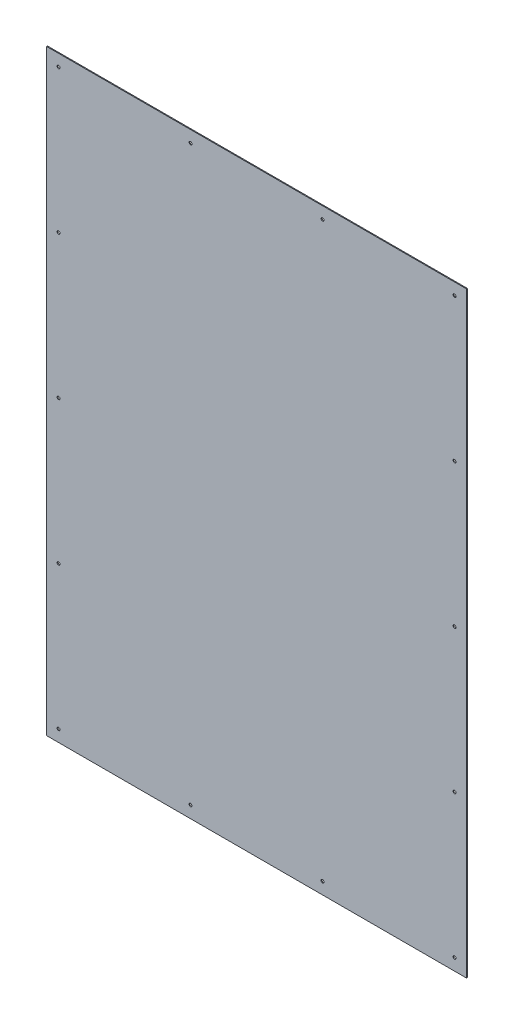
ISO-10303-21;
HEADER;
FILE_DESCRIPTION(('STEP AP214'),'2;1');
FILE_NAME('part.step','',(''),(''),'','','');
FILE_SCHEMA(('AUTOMOTIVE_DESIGN { 1 0 10303 214 1 1 1 1 }'));
ENDSEC;
DATA;
#1=APPLICATION_CONTEXT('core data for automotive mechanical design processes');
#2=APPLICATION_PROTOCOL_DEFINITION('international standard','automotive_design',2000,#1);
#3=PRODUCT_CONTEXT('',#1,'mechanical');
#4=PRODUCT('Part','Part','',(#3));
#5=PRODUCT_RELATED_PRODUCT_CATEGORY('part','',(#4));
#6=PRODUCT_DEFINITION_FORMATION('','',#4);
#7=PRODUCT_DEFINITION_CONTEXT('part definition',#1,'design');
#8=PRODUCT_DEFINITION('design','',#6,#7);
#9=PRODUCT_DEFINITION_SHAPE('','',#8);
#10=(LENGTH_UNIT() NAMED_UNIT(*) SI_UNIT(.MILLI.,.METRE.));
#11=(NAMED_UNIT(*) PLANE_ANGLE_UNIT() SI_UNIT($,.RADIAN.));
#12=(NAMED_UNIT(*) SI_UNIT($,.STERADIAN.) SOLID_ANGLE_UNIT());
#13=UNCERTAINTY_MEASURE_WITH_UNIT(LENGTH_MEASURE(1.E-05),#10,'distance_accuracy_value','');
#14=(GEOMETRIC_REPRESENTATION_CONTEXT(3) GLOBAL_UNCERTAINTY_ASSIGNED_CONTEXT((#13)) GLOBAL_UNIT_ASSIGNED_CONTEXT((#10,
#11,#12)) REPRESENTATION_CONTEXT('',''));
#15=CARTESIAN_POINT('',(0.,0.,0.));
#16=DIRECTION('',(0.,0.,1.));
#17=DIRECTION('',(1.,0.,0.));
#18=AXIS2_PLACEMENT_3D('',#15,#16,#17);
#19=CARTESIAN_POINT('',(450.,640.,1.9));
#20=DIRECTION('',(-1.,0.,0.));
#21=DIRECTION('',(0.,-1.,0.));
#22=AXIS2_PLACEMENT_3D('',#19,#20,#21);
#23=PLANE('',#22);
#24=DIRECTION('',(0.,1.,0.));
#25=VECTOR('',#24,1.);
#26=CARTESIAN_POINT('',(450.,640.,0.));
#27=LINE('',#26,#25);
#28=CARTESIAN_POINT('',(450.,-640.,0.));
#29=VERTEX_POINT('',#28);
#30=CARTESIAN_POINT('',(450.,640.,0.));
#31=VERTEX_POINT('',#30);
#32=EDGE_CURVE('E98',#29,#31,#27,.T.);
#33=ORIENTED_EDGE('',*,*,#32,.T.);
#34=DIRECTION('',(0.,0.,-1.));
#35=VECTOR('',#34,1.);
#36=CARTESIAN_POINT('',(450.,640.,1.9));
#37=LINE('',#36,#35);
#38=CARTESIAN_POINT('',(450.,640.,1.9));
#39=VERTEX_POINT('',#38);
#40=EDGE_CURVE('E11',#39,#31,#37,.T.);
#41=ORIENTED_EDGE('',*,*,#40,.F.);
#42=DIRECTION('',(0.,1.,0.));
#43=VECTOR('',#42,1.);
#44=CARTESIAN_POINT('',(450.,640.,1.9));
#45=LINE('',#44,#43);
#46=CARTESIAN_POINT('',(450.,-640.,1.9));
#47=VERTEX_POINT('',#46);
#48=EDGE_CURVE('E85',#47,#39,#45,.T.);
#49=ORIENTED_EDGE('',*,*,#48,.F.);
#50=DIRECTION('',(0.,0.,-1.));
#51=VECTOR('',#50,1.);
#52=CARTESIAN_POINT('',(450.,-640.,1.9));
#53=LINE('',#52,#51);
#54=EDGE_CURVE('E94',#47,#29,#53,.T.);
#55=ORIENTED_EDGE('',*,*,#54,.T.);
#56=EDGE_LOOP('',(#33,#41,#49,#55));
#57=FACE_BOUND('',#56,.T.);
#58=ADVANCED_FACE('F32',(#57),#23,.F.);
#59=CARTESIAN_POINT('',(-450.,640.,1.9));
#60=DIRECTION('',(0.,-1.,0.));
#61=DIRECTION('',(0.,0.,-1.));
#62=AXIS2_PLACEMENT_3D('',#59,#60,#61);
#63=PLANE('',#62);
#64=DIRECTION('',(-1.,0.,0.));
#65=VECTOR('',#64,1.);
#66=CARTESIAN_POINT('',(-450.,640.,0.));
#67=LINE('',#66,#65);
#68=CARTESIAN_POINT('',(-450.,640.,0.));
#69=VERTEX_POINT('',#68);
#70=EDGE_CURVE('E89',#31,#69,#67,.T.);
#71=ORIENTED_EDGE('',*,*,#70,.T.);
#72=DIRECTION('',(0.,0.,-1.));
#73=VECTOR('',#72,1.);
#74=CARTESIAN_POINT('',(-450.,640.,1.9));
#75=LINE('',#74,#73);
#76=CARTESIAN_POINT('',(-450.,640.,1.9));
#77=VERTEX_POINT('',#76);
#78=EDGE_CURVE('E41',#77,#69,#75,.T.);
#79=ORIENTED_EDGE('',*,*,#78,.F.);
#80=DIRECTION('',(-1.,0.,0.));
#81=VECTOR('',#80,1.);
#82=CARTESIAN_POINT('',(-450.,640.,1.9));
#83=LINE('',#82,#81);
#84=EDGE_CURVE('E80',#39,#77,#83,.T.);
#85=ORIENTED_EDGE('',*,*,#84,.F.);
#86=ORIENTED_EDGE('',*,*,#40,.T.);
#87=EDGE_LOOP('',(#71,#79,#85,#86));
#88=FACE_BOUND('',#87,.T.);
#89=ADVANCED_FACE('F88',(#88),#63,.F.);
#90=CARTESIAN_POINT('',(-450.,640.,1.9));
#91=DIRECTION('',(1.,0.,0.));
#92=DIRECTION('',(0.,1.,0.));
#93=AXIS2_PLACEMENT_3D('',#90,#91,#92);
#94=PLANE('',#93);
#95=DIRECTION('',(0.,-1.,0.));
#96=VECTOR('',#95,1.);
#97=CARTESIAN_POINT('',(-450.,640.,0.));
#98=LINE('',#97,#96);
#99=CARTESIAN_POINT('',(-450.,-640.,0.));
#100=VERTEX_POINT('',#99);
#101=EDGE_CURVE('E67',#69,#100,#98,.T.);
#102=ORIENTED_EDGE('',*,*,#101,.T.);
#103=DIRECTION('',(0.,0.,-1.));
#104=VECTOR('',#103,1.);
#105=CARTESIAN_POINT('',(-450.,-640.,1.9));
#106=LINE('',#105,#104);
#107=CARTESIAN_POINT('',(-450.,-640.,1.9));
#108=VERTEX_POINT('',#107);
#109=EDGE_CURVE('E90',#108,#100,#106,.T.);
#110=ORIENTED_EDGE('',*,*,#109,.F.);
#111=DIRECTION('',(0.,-1.,0.));
#112=VECTOR('',#111,1.);
#113=CARTESIAN_POINT('',(-450.,640.,1.9));
#114=LINE('',#113,#112);
#115=EDGE_CURVE('E83',#77,#108,#114,.T.);
#116=ORIENTED_EDGE('',*,*,#115,.F.);
#117=ORIENTED_EDGE('',*,*,#78,.T.);
#118=EDGE_LOOP('',(#102,#110,#116,#117));
#119=FACE_BOUND('',#118,.T.);
#120=ADVANCED_FACE('F92',(#119),#94,.F.);
#121=CARTESIAN_POINT('',(-450.,-640.,1.9));
#122=DIRECTION('',(0.,1.,0.));
#123=DIRECTION('',(0.,0.,1.));
#124=AXIS2_PLACEMENT_3D('',#121,#122,#123);
#125=PLANE('',#124);
#126=DIRECTION('',(1.,0.,0.));
#127=VECTOR('',#126,1.);
#128=CARTESIAN_POINT('',(-450.,-640.,0.));
#129=LINE('',#128,#127);
#130=EDGE_CURVE('E73',#100,#29,#129,.T.);
#131=ORIENTED_EDGE('',*,*,#130,.T.);
#132=ORIENTED_EDGE('',*,*,#54,.F.);
#133=DIRECTION('',(1.,0.,0.));
#134=VECTOR('',#133,1.);
#135=CARTESIAN_POINT('',(-450.,-640.,1.9));
#136=LINE('',#135,#134);
#137=EDGE_CURVE('E50',#108,#47,#136,.T.);
#138=ORIENTED_EDGE('',*,*,#137,.F.);
#139=ORIENTED_EDGE('',*,*,#109,.T.);
#140=EDGE_LOOP('',(#131,#132,#138,#139));
#141=FACE_BOUND('',#140,.T.);
#142=ADVANCED_FACE('F200',(#141),#125,.F.);
#143=CARTESIAN_POINT('',(0.,0.,1.9));
#144=DIRECTION('',(0.,0.,1.));
#145=DIRECTION('',(1.,0.,0.));
#146=AXIS2_PLACEMENT_3D('',#143,#144,#145);
#147=PLANE('',#146);
#148=CARTESIAN_POINT('',(141.52,-614.6,1.9));
#149=DIRECTION('',(0.,0.,1.));
#150=DIRECTION('',(-1.,0.,0.));
#151=AXIS2_PLACEMENT_3D('',#148,#149,#150);
#152=CIRCLE('',#151,3.15000000000002);
#153=CARTESIAN_POINT('',(138.37,-614.6,1.9));
#154=VERTEX_POINT('',#153);
#155=EDGE_CURVE('E176',#154,#154,#152,.T.);
#156=ORIENTED_EDGE('',*,*,#155,.F.);
#157=EDGE_LOOP('',(#156));
#158=FACE_BOUND('',#157,.T.);
#159=CARTESIAN_POINT('',(-141.54,-614.6,1.9));
#160=DIRECTION('',(0.,0.,1.));
#161=DIRECTION('',(-1.,0.,0.));
#162=AXIS2_PLACEMENT_3D('',#159,#160,#161);
#163=CIRCLE('',#162,3.15000000000002);
#164=CARTESIAN_POINT('',(-144.69,-614.6,1.9));
#165=VERTEX_POINT('',#164);
#166=EDGE_CURVE('E173',#165,#165,#163,.T.);
#167=ORIENTED_EDGE('',*,*,#166,.F.);
#168=EDGE_LOOP('',(#167));
#169=FACE_BOUND('',#168,.T.);
#170=CARTESIAN_POINT('',(424.6,-614.6,1.9));
#171=DIRECTION('',(0.,0.,1.));
#172=DIRECTION('',(-1.,0.,0.));
#173=AXIS2_PLACEMENT_3D('',#170,#171,#172);
#174=CIRCLE('',#173,3.17500000000013);
#175=CARTESIAN_POINT('',(421.425,-614.6,1.9));
#176=VERTEX_POINT('',#175);
#177=EDGE_CURVE('E177',#176,#176,#174,.T.);
#178=ORIENTED_EDGE('',*,*,#177,.F.);
#179=EDGE_LOOP('',(#178));
#180=FACE_BOUND('',#179,.T.);
#181=CARTESIAN_POINT('',(-424.6,-614.6,1.9));
#182=DIRECTION('',(0.,0.,1.));
#183=DIRECTION('',(-1.,0.,0.));
#184=AXIS2_PLACEMENT_3D('',#181,#182,#183);
#185=CIRCLE('',#184,3.15000000000018);
#186=CARTESIAN_POINT('',(-427.75,-614.6,1.9));
#187=VERTEX_POINT('',#186);
#188=EDGE_CURVE('E181',#187,#187,#185,.T.);
#189=ORIENTED_EDGE('',*,*,#188,.F.);
#190=EDGE_LOOP('',(#189));
#191=FACE_BOUND('',#190,.T.);
#192=CARTESIAN_POINT('',(424.6,307.3,1.9));
#193=DIRECTION('',(0.,0.,1.));
#194=DIRECTION('',(-1.,0.,0.));
#195=AXIS2_PLACEMENT_3D('',#192,#193,#194);
#196=CIRCLE('',#195,3.17499999999997);
#197=CARTESIAN_POINT('',(421.425,307.3,1.9));
#198=VERTEX_POINT('',#197);
#199=EDGE_CURVE('E180',#198,#198,#196,.T.);
#200=ORIENTED_EDGE('',*,*,#199,.F.);
#201=EDGE_LOOP('',(#200));
#202=FACE_BOUND('',#201,.T.);
#203=CARTESIAN_POINT('',(424.6,-2.22044604925031E-13,1.9));
#204=DIRECTION('',(0.,0.,1.));
#205=DIRECTION('',(-1.,0.,0.));
#206=AXIS2_PLACEMENT_3D('',#203,#204,#205);
#207=CIRCLE('',#206,3.17499999999997);
#208=CARTESIAN_POINT('',(421.425,-2.22044604925031E-13,1.9));
#209=VERTEX_POINT('',#208);
#210=EDGE_CURVE('E188',#209,#209,#207,.T.);
#211=ORIENTED_EDGE('',*,*,#210,.F.);
#212=EDGE_LOOP('',(#211));
#213=FACE_BOUND('',#212,.T.);
#214=CARTESIAN_POINT('',(424.6,-307.3,1.9));
#215=DIRECTION('',(0.,0.,1.));
#216=DIRECTION('',(-1.,0.,0.));
#217=AXIS2_PLACEMENT_3D('',#214,#215,#216);
#218=CIRCLE('',#217,3.17499999999997);
#219=CARTESIAN_POINT('',(421.425,-307.3,1.9));
#220=VERTEX_POINT('',#219);
#221=EDGE_CURVE('E170',#220,#220,#218,.T.);
#222=ORIENTED_EDGE('',*,*,#221,.F.);
#223=EDGE_LOOP('',(#222));
#224=FACE_BOUND('',#223,.T.);
#225=CARTESIAN_POINT('',(-424.6,307.3,1.9));
#226=DIRECTION('',(0.,0.,1.));
#227=DIRECTION('',(1.,0.,0.));
#228=AXIS2_PLACEMENT_3D('',#225,#226,#227);
#229=CIRCLE('',#228,3.17499999999997);
#230=CARTESIAN_POINT('',(-421.425,307.3,1.9));
#231=VERTEX_POINT('',#230);
#232=EDGE_CURVE('E158',#231,#231,#229,.T.);
#233=ORIENTED_EDGE('',*,*,#232,.F.);
#234=EDGE_LOOP('',(#233));
#235=FACE_BOUND('',#234,.T.);
#236=CARTESIAN_POINT('',(424.6,614.6,1.9));
#237=DIRECTION('',(0.,0.,1.));
#238=DIRECTION('',(1.,0.,0.));
#239=AXIS2_PLACEMENT_3D('',#236,#237,#238);
#240=CIRCLE('',#239,3.17499999999997);
#241=CARTESIAN_POINT('',(427.775,614.6,1.9));
#242=VERTEX_POINT('',#241);
#243=EDGE_CURVE('E157',#242,#242,#240,.T.);
#244=ORIENTED_EDGE('',*,*,#243,.F.);
#245=EDGE_LOOP('',(#244));
#246=FACE_BOUND('',#245,.T.);
#247=CARTESIAN_POINT('',(-424.6,614.6,1.9));
#248=DIRECTION('',(0.,0.,1.));
#249=DIRECTION('',(1.,0.,0.));
#250=AXIS2_PLACEMENT_3D('',#247,#248,#249);
#251=CIRCLE('',#250,3.15000000000002);
#252=CARTESIAN_POINT('',(-421.45,614.6,1.9));
#253=VERTEX_POINT('',#252);
#254=EDGE_CURVE('E114',#253,#253,#251,.T.);
#255=ORIENTED_EDGE('',*,*,#254,.F.);
#256=EDGE_LOOP('',(#255));
#257=FACE_BOUND('',#256,.T.);
#258=CARTESIAN_POINT('',(-424.6,-307.3,1.9));
#259=DIRECTION('',(0.,0.,1.));
#260=DIRECTION('',(1.,0.,0.));
#261=AXIS2_PLACEMENT_3D('',#258,#259,#260);
#262=CIRCLE('',#261,3.17499999999997);
#263=CARTESIAN_POINT('',(-421.425,-307.3,1.9));
#264=VERTEX_POINT('',#263);
#265=EDGE_CURVE('E167',#264,#264,#262,.T.);
#266=ORIENTED_EDGE('',*,*,#265,.F.);
#267=EDGE_LOOP('',(#266));
#268=FACE_BOUND('',#267,.T.);
#269=CARTESIAN_POINT('',(141.52,614.6,1.9));
#270=DIRECTION('',(0.,0.,1.));
#271=DIRECTION('',(1.,0.,0.));
#272=AXIS2_PLACEMENT_3D('',#269,#270,#271);
#273=CIRCLE('',#272,3.15000000000002);
#274=CARTESIAN_POINT('',(144.67,614.6,1.9));
#275=VERTEX_POINT('',#274);
#276=EDGE_CURVE('E166',#275,#275,#273,.T.);
#277=ORIENTED_EDGE('',*,*,#276,.F.);
#278=EDGE_LOOP('',(#277));
#279=FACE_BOUND('',#278,.T.);
#280=CARTESIAN_POINT('',(-141.54,614.6,1.9));
#281=DIRECTION('',(0.,0.,1.));
#282=DIRECTION('',(1.,0.,0.));
#283=AXIS2_PLACEMENT_3D('',#280,#281,#282);
#284=CIRCLE('',#283,3.15000000000002);
#285=CARTESIAN_POINT('',(-138.39,614.6,1.9));
#286=VERTEX_POINT('',#285);
#287=EDGE_CURVE('E161',#286,#286,#284,.T.);
#288=ORIENTED_EDGE('',*,*,#287,.F.);
#289=EDGE_LOOP('',(#288));
#290=FACE_BOUND('',#289,.T.);
#291=CARTESIAN_POINT('',(-424.6,-2.22044604925031E-13,1.9));
#292=DIRECTION('',(0.,0.,1.));
#293=DIRECTION('',(1.,0.,0.));
#294=AXIS2_PLACEMENT_3D('',#291,#292,#293);
#295=CIRCLE('',#294,3.17499999999997);
#296=CARTESIAN_POINT('',(-421.425,-2.22044604925031E-13,1.9));
#297=VERTEX_POINT('',#296);
#298=EDGE_CURVE('E109',#297,#297,#295,.T.);
#299=ORIENTED_EDGE('',*,*,#298,.F.);
#300=EDGE_LOOP('',(#299));
#301=FACE_BOUND('',#300,.T.);
#302=ORIENTED_EDGE('',*,*,#48,.T.);
#303=ORIENTED_EDGE('',*,*,#84,.T.);
#304=ORIENTED_EDGE('',*,*,#115,.T.);
#305=ORIENTED_EDGE('',*,*,#137,.T.);
#306=EDGE_LOOP('',(#302,#303,#304,#305));
#307=FACE_BOUND('',#306,.T.);
#308=ADVANCED_FACE('F81',(#158,#169,#180,#191,#202,#213,#224,#235,#246,#257,#268,#279,#290,#301,
#307),#147,.T.);
#309=CARTESIAN_POINT('',(0.,0.,0.));
#310=DIRECTION('',(0.,0.,1.));
#311=DIRECTION('',(1.,0.,0.));
#312=AXIS2_PLACEMENT_3D('',#309,#310,#311);
#313=PLANE('',#312);
#314=CARTESIAN_POINT('',(141.52,-614.6,0.));
#315=DIRECTION('',(0.,0.,1.));
#316=DIRECTION('',(1.,0.,0.));
#317=AXIS2_PLACEMENT_3D('',#314,#315,#316);
#318=CIRCLE('',#317,3.15000000000002);
#319=CARTESIAN_POINT('',(144.67,-614.6,0.));
#320=VERTEX_POINT('',#319);
#321=EDGE_CURVE('E35',#320,#320,#318,.T.);
#322=ORIENTED_EDGE('',*,*,#321,.T.);
#323=EDGE_LOOP('',(#322));
#324=FACE_BOUND('',#323,.T.);
#325=CARTESIAN_POINT('',(-141.54,-614.6,0.));
#326=DIRECTION('',(0.,0.,1.));
#327=DIRECTION('',(1.,0.,0.));
#328=AXIS2_PLACEMENT_3D('',#325,#326,#327);
#329=CIRCLE('',#328,3.15000000000002);
#330=CARTESIAN_POINT('',(-138.39,-614.6,0.));
#331=VERTEX_POINT('',#330);
#332=EDGE_CURVE('E143',#331,#331,#329,.T.);
#333=ORIENTED_EDGE('',*,*,#332,.T.);
#334=EDGE_LOOP('',(#333));
#335=FACE_BOUND('',#334,.T.);
#336=CARTESIAN_POINT('',(424.6,-614.6,0.));
#337=DIRECTION('',(0.,0.,1.));
#338=DIRECTION('',(1.,0.,0.));
#339=AXIS2_PLACEMENT_3D('',#336,#337,#338);
#340=CIRCLE('',#339,3.17500000000013);
#341=CARTESIAN_POINT('',(427.775,-614.6,0.));
#342=VERTEX_POINT('',#341);
#343=EDGE_CURVE('E141',#342,#342,#340,.T.);
#344=ORIENTED_EDGE('',*,*,#343,.T.);
#345=EDGE_LOOP('',(#344));
#346=FACE_BOUND('',#345,.T.);
#347=CARTESIAN_POINT('',(-424.6,-614.6,0.));
#348=DIRECTION('',(0.,0.,1.));
#349=DIRECTION('',(1.,0.,0.));
#350=AXIS2_PLACEMENT_3D('',#347,#348,#349);
#351=CIRCLE('',#350,3.15000000000018);
#352=CARTESIAN_POINT('',(-421.45,-614.6,0.));
#353=VERTEX_POINT('',#352);
#354=EDGE_CURVE('E138',#353,#353,#351,.T.);
#355=ORIENTED_EDGE('',*,*,#354,.T.);
#356=EDGE_LOOP('',(#355));
#357=FACE_BOUND('',#356,.T.);
#358=CARTESIAN_POINT('',(424.6,307.3,0.));
#359=DIRECTION('',(0.,0.,1.));
#360=DIRECTION('',(1.,0.,0.));
#361=AXIS2_PLACEMENT_3D('',#358,#359,#360);
#362=CIRCLE('',#361,3.17499999999997);
#363=CARTESIAN_POINT('',(427.775,307.3,0.));
#364=VERTEX_POINT('',#363);
#365=EDGE_CURVE('E135',#364,#364,#362,.T.);
#366=ORIENTED_EDGE('',*,*,#365,.T.);
#367=EDGE_LOOP('',(#366));
#368=FACE_BOUND('',#367,.T.);
#369=CARTESIAN_POINT('',(424.6,-2.22044604925031E-13,0.));
#370=DIRECTION('',(0.,0.,1.));
#371=DIRECTION('',(1.,0.,0.));
#372=AXIS2_PLACEMENT_3D('',#369,#370,#371);
#373=CIRCLE('',#372,3.17499999999997);
#374=CARTESIAN_POINT('',(427.775,-2.22044604925031E-13,0.));
#375=VERTEX_POINT('',#374);
#376=EDGE_CURVE('E132',#375,#375,#373,.T.);
#377=ORIENTED_EDGE('',*,*,#376,.T.);
#378=EDGE_LOOP('',(#377));
#379=FACE_BOUND('',#378,.T.);
#380=CARTESIAN_POINT('',(424.6,-307.3,0.));
#381=DIRECTION('',(0.,0.,1.));
#382=DIRECTION('',(1.,0.,0.));
#383=AXIS2_PLACEMENT_3D('',#380,#381,#382);
#384=CIRCLE('',#383,3.17499999999997);
#385=CARTESIAN_POINT('',(427.775,-307.3,0.));
#386=VERTEX_POINT('',#385);
#387=EDGE_CURVE('E129',#386,#386,#384,.T.);
#388=ORIENTED_EDGE('',*,*,#387,.T.);
#389=EDGE_LOOP('',(#388));
#390=FACE_BOUND('',#389,.T.);
#391=CARTESIAN_POINT('',(-424.6,307.3,0.));
#392=DIRECTION('',(0.,0.,1.));
#393=DIRECTION('',(1.,0.,0.));
#394=AXIS2_PLACEMENT_3D('',#391,#392,#393);
#395=CIRCLE('',#394,3.17499999999997);
#396=CARTESIAN_POINT('',(-421.425,307.3,0.));
#397=VERTEX_POINT('',#396);
#398=EDGE_CURVE('E126',#397,#397,#395,.T.);
#399=ORIENTED_EDGE('',*,*,#398,.T.);
#400=EDGE_LOOP('',(#399));
#401=FACE_BOUND('',#400,.T.);
#402=CARTESIAN_POINT('',(424.6,614.6,0.));
#403=DIRECTION('',(0.,0.,1.));
#404=DIRECTION('',(1.,0.,0.));
#405=AXIS2_PLACEMENT_3D('',#402,#403,#404);
#406=CIRCLE('',#405,3.17499999999997);
#407=CARTESIAN_POINT('',(427.775,614.6,0.));
#408=VERTEX_POINT('',#407);
#409=EDGE_CURVE('E123',#408,#408,#406,.T.);
#410=ORIENTED_EDGE('',*,*,#409,.T.);
#411=EDGE_LOOP('',(#410));
#412=FACE_BOUND('',#411,.T.);
#413=CARTESIAN_POINT('',(-424.6,614.6,0.));
#414=DIRECTION('',(0.,0.,1.));
#415=DIRECTION('',(1.,0.,0.));
#416=AXIS2_PLACEMENT_3D('',#413,#414,#415);
#417=CIRCLE('',#416,3.15000000000002);
#418=CARTESIAN_POINT('',(-421.45,614.6,0.));
#419=VERTEX_POINT('',#418);
#420=EDGE_CURVE('E120',#419,#419,#417,.T.);
#421=ORIENTED_EDGE('',*,*,#420,.T.);
#422=EDGE_LOOP('',(#421));
#423=FACE_BOUND('',#422,.T.);
#424=CARTESIAN_POINT('',(-424.6,-307.3,0.));
#425=DIRECTION('',(0.,0.,1.));
#426=DIRECTION('',(1.,0.,0.));
#427=AXIS2_PLACEMENT_3D('',#424,#425,#426);
#428=CIRCLE('',#427,3.17499999999997);
#429=CARTESIAN_POINT('',(-421.425,-307.3,0.));
#430=VERTEX_POINT('',#429);
#431=EDGE_CURVE('E117',#430,#430,#428,.T.);
#432=ORIENTED_EDGE('',*,*,#431,.T.);
#433=EDGE_LOOP('',(#432));
#434=FACE_BOUND('',#433,.T.);
#435=CARTESIAN_POINT('',(141.52,614.6,0.));
#436=DIRECTION('',(0.,0.,1.));
#437=DIRECTION('',(1.,0.,0.));
#438=AXIS2_PLACEMENT_3D('',#435,#436,#437);
#439=CIRCLE('',#438,3.15000000000002);
#440=CARTESIAN_POINT('',(144.67,614.6,0.));
#441=VERTEX_POINT('',#440);
#442=EDGE_CURVE('E113',#441,#441,#439,.T.);
#443=ORIENTED_EDGE('',*,*,#442,.T.);
#444=EDGE_LOOP('',(#443));
#445=FACE_BOUND('',#444,.T.);
#446=CARTESIAN_POINT('',(-141.54,614.6,0.));
#447=DIRECTION('',(0.,0.,1.));
#448=DIRECTION('',(1.,0.,0.));
#449=AXIS2_PLACEMENT_3D('',#446,#447,#448);
#450=CIRCLE('',#449,3.15000000000002);
#451=CARTESIAN_POINT('',(-138.39,614.6,0.));
#452=VERTEX_POINT('',#451);
#453=EDGE_CURVE('E110',#452,#452,#450,.T.);
#454=ORIENTED_EDGE('',*,*,#453,.T.);
#455=EDGE_LOOP('',(#454));
#456=FACE_BOUND('',#455,.T.);
#457=CARTESIAN_POINT('',(-424.6,-2.22044604925031E-13,0.));
#458=DIRECTION('',(0.,0.,1.));
#459=DIRECTION('',(1.,0.,0.));
#460=AXIS2_PLACEMENT_3D('',#457,#458,#459);
#461=CIRCLE('',#460,3.17499999999997);
#462=CARTESIAN_POINT('',(-421.425,-2.22044604925031E-13,0.));
#463=VERTEX_POINT('',#462);
#464=EDGE_CURVE('E101',#463,#463,#461,.T.);
#465=ORIENTED_EDGE('',*,*,#464,.T.);
#466=EDGE_LOOP('',(#465));
#467=FACE_BOUND('',#466,.T.);
#468=ORIENTED_EDGE('',*,*,#32,.F.);
#469=ORIENTED_EDGE('',*,*,#130,.F.);
#470=ORIENTED_EDGE('',*,*,#101,.F.);
#471=ORIENTED_EDGE('',*,*,#70,.F.);
#472=EDGE_LOOP('',(#468,#469,#470,#471));
#473=FACE_BOUND('',#472,.T.);
#474=ADVANCED_FACE('F199',(#324,#335,#346,#357,#368,#379,#390,#401,#412,#423,#434,#445,#456,
#467,#473),#313,.F.);
#475=CARTESIAN_POINT('',(-424.6,-2.22044604925031E-13,-8.1));
#476=DIRECTION('',(0.,0.,1.));
#477=DIRECTION('',(1.,0.,0.));
#478=AXIS2_PLACEMENT_3D('',#475,#476,#477);
#479=CYLINDRICAL_SURFACE('',#478,3.17499999999997);
#480=ORIENTED_EDGE('',*,*,#298,.T.);
#481=EDGE_LOOP('',(#480));
#482=FACE_BOUND('',#481,.T.);
#483=ORIENTED_EDGE('',*,*,#464,.F.);
#484=EDGE_LOOP('',(#483));
#485=FACE_BOUND('',#484,.T.);
#486=ADVANCED_FACE('F220',(#482,#485),#479,.F.);
#487=CARTESIAN_POINT('',(-141.54,614.6,-8.1));
#488=DIRECTION('',(0.,0.,1.));
#489=DIRECTION('',(1.,0.,0.));
#490=AXIS2_PLACEMENT_3D('',#487,#488,#489);
#491=CYLINDRICAL_SURFACE('',#490,3.15000000000002);
#492=ORIENTED_EDGE('',*,*,#287,.T.);
#493=EDGE_LOOP('',(#492));
#494=FACE_BOUND('',#493,.T.);
#495=ORIENTED_EDGE('',*,*,#453,.F.);
#496=EDGE_LOOP('',(#495));
#497=FACE_BOUND('',#496,.T.);
#498=ADVANCED_FACE('F216',(#494,#497),#491,.F.);
#499=CARTESIAN_POINT('',(141.52,614.6,-8.1));
#500=DIRECTION('',(0.,0.,1.));
#501=DIRECTION('',(1.,0.,0.));
#502=AXIS2_PLACEMENT_3D('',#499,#500,#501);
#503=CYLINDRICAL_SURFACE('',#502,3.15000000000002);
#504=ORIENTED_EDGE('',*,*,#276,.T.);
#505=EDGE_LOOP('',(#504));
#506=FACE_BOUND('',#505,.T.);
#507=ORIENTED_EDGE('',*,*,#442,.F.);
#508=EDGE_LOOP('',(#507));
#509=FACE_BOUND('',#508,.T.);
#510=ADVANCED_FACE('F219',(#506,#509),#503,.F.);
#511=CARTESIAN_POINT('',(-424.6,-307.3,-8.1));
#512=DIRECTION('',(0.,0.,1.));
#513=DIRECTION('',(1.,0.,0.));
#514=AXIS2_PLACEMENT_3D('',#511,#512,#513);
#515=CYLINDRICAL_SURFACE('',#514,3.17499999999997);
#516=ORIENTED_EDGE('',*,*,#265,.T.);
#517=EDGE_LOOP('',(#516));
#518=FACE_BOUND('',#517,.T.);
#519=ORIENTED_EDGE('',*,*,#431,.F.);
#520=EDGE_LOOP('',(#519));
#521=FACE_BOUND('',#520,.T.);
#522=ADVANCED_FACE('F286',(#518,#521),#515,.F.);
#523=CARTESIAN_POINT('',(-424.6,614.6,-8.1));
#524=DIRECTION('',(0.,0.,1.));
#525=DIRECTION('',(1.,0.,0.));
#526=AXIS2_PLACEMENT_3D('',#523,#524,#525);
#527=CYLINDRICAL_SURFACE('',#526,3.15000000000002);
#528=ORIENTED_EDGE('',*,*,#254,.T.);
#529=EDGE_LOOP('',(#528));
#530=FACE_BOUND('',#529,.T.);
#531=ORIENTED_EDGE('',*,*,#420,.F.);
#532=EDGE_LOOP('',(#531));
#533=FACE_BOUND('',#532,.T.);
#534=ADVANCED_FACE('F296',(#530,#533),#527,.F.);
#535=CARTESIAN_POINT('',(424.6,614.6,-8.1));
#536=DIRECTION('',(0.,0.,1.));
#537=DIRECTION('',(1.,0.,0.));
#538=AXIS2_PLACEMENT_3D('',#535,#536,#537);
#539=CYLINDRICAL_SURFACE('',#538,3.17499999999997);
#540=ORIENTED_EDGE('',*,*,#243,.T.);
#541=EDGE_LOOP('',(#540));
#542=FACE_BOUND('',#541,.T.);
#543=ORIENTED_EDGE('',*,*,#409,.F.);
#544=EDGE_LOOP('',(#543));
#545=FACE_BOUND('',#544,.T.);
#546=ADVANCED_FACE('F306',(#542,#545),#539,.F.);
#547=CARTESIAN_POINT('',(-424.6,307.3,-8.1));
#548=DIRECTION('',(0.,0.,1.));
#549=DIRECTION('',(1.,0.,0.));
#550=AXIS2_PLACEMENT_3D('',#547,#548,#549);
#551=CYLINDRICAL_SURFACE('',#550,3.17499999999997);
#552=ORIENTED_EDGE('',*,*,#232,.T.);
#553=EDGE_LOOP('',(#552));
#554=FACE_BOUND('',#553,.T.);
#555=ORIENTED_EDGE('',*,*,#398,.F.);
#556=EDGE_LOOP('',(#555));
#557=FACE_BOUND('',#556,.T.);
#558=ADVANCED_FACE('F316',(#554,#557),#551,.F.);
#559=CARTESIAN_POINT('',(424.6,-307.3,-8.1));
#560=DIRECTION('',(0.,0.,1.));
#561=DIRECTION('',(1.,0.,0.));
#562=AXIS2_PLACEMENT_3D('',#559,#560,#561);
#563=CYLINDRICAL_SURFACE('',#562,3.17499999999997);
#564=ORIENTED_EDGE('',*,*,#221,.T.);
#565=EDGE_LOOP('',(#564));
#566=FACE_BOUND('',#565,.T.);
#567=ORIENTED_EDGE('',*,*,#387,.F.);
#568=EDGE_LOOP('',(#567));
#569=FACE_BOUND('',#568,.T.);
#570=ADVANCED_FACE('F194',(#566,#569),#563,.F.);
#571=CARTESIAN_POINT('',(424.6,-2.22044604925031E-13,-8.1));
#572=DIRECTION('',(0.,0.,1.));
#573=DIRECTION('',(1.,0.,0.));
#574=AXIS2_PLACEMENT_3D('',#571,#572,#573);
#575=CYLINDRICAL_SURFACE('',#574,3.17499999999997);
#576=ORIENTED_EDGE('',*,*,#210,.T.);
#577=EDGE_LOOP('',(#576));
#578=FACE_BOUND('',#577,.T.);
#579=ORIENTED_EDGE('',*,*,#376,.F.);
#580=EDGE_LOOP('',(#579));
#581=FACE_BOUND('',#580,.T.);
#582=ADVANCED_FACE('F335',(#578,#581),#575,.F.);
#583=CARTESIAN_POINT('',(424.6,307.3,-8.1));
#584=DIRECTION('',(0.,0.,1.));
#585=DIRECTION('',(1.,0.,0.));
#586=AXIS2_PLACEMENT_3D('',#583,#584,#585);
#587=CYLINDRICAL_SURFACE('',#586,3.17499999999997);
#588=ORIENTED_EDGE('',*,*,#199,.T.);
#589=EDGE_LOOP('',(#588));
#590=FACE_BOUND('',#589,.T.);
#591=ORIENTED_EDGE('',*,*,#365,.F.);
#592=EDGE_LOOP('',(#591));
#593=FACE_BOUND('',#592,.T.);
#594=ADVANCED_FACE('F344',(#590,#593),#587,.F.);
#595=CARTESIAN_POINT('',(-424.6,-614.6,-8.1));
#596=DIRECTION('',(0.,0.,1.));
#597=DIRECTION('',(1.,0.,0.));
#598=AXIS2_PLACEMENT_3D('',#595,#596,#597);
#599=CYLINDRICAL_SURFACE('',#598,3.15000000000018);
#600=ORIENTED_EDGE('',*,*,#188,.T.);
#601=EDGE_LOOP('',(#600));
#602=FACE_BOUND('',#601,.T.);
#603=ORIENTED_EDGE('',*,*,#354,.F.);
#604=EDGE_LOOP('',(#603));
#605=FACE_BOUND('',#604,.T.);
#606=ADVANCED_FACE('F354',(#602,#605),#599,.F.);
#607=CARTESIAN_POINT('',(424.6,-614.6,-8.1));
#608=DIRECTION('',(0.,0.,1.));
#609=DIRECTION('',(1.,0.,0.));
#610=AXIS2_PLACEMENT_3D('',#607,#608,#609);
#611=CYLINDRICAL_SURFACE('',#610,3.17500000000013);
#612=ORIENTED_EDGE('',*,*,#177,.T.);
#613=EDGE_LOOP('',(#612));
#614=FACE_BOUND('',#613,.T.);
#615=ORIENTED_EDGE('',*,*,#343,.F.);
#616=EDGE_LOOP('',(#615));
#617=FACE_BOUND('',#616,.T.);
#618=ADVANCED_FACE('F364',(#614,#617),#611,.F.);
#619=CARTESIAN_POINT('',(-141.54,-614.6,-8.1));
#620=DIRECTION('',(0.,0.,1.));
#621=DIRECTION('',(1.,0.,0.));
#622=AXIS2_PLACEMENT_3D('',#619,#620,#621);
#623=CYLINDRICAL_SURFACE('',#622,3.15000000000002);
#624=ORIENTED_EDGE('',*,*,#166,.T.);
#625=EDGE_LOOP('',(#624));
#626=FACE_BOUND('',#625,.T.);
#627=ORIENTED_EDGE('',*,*,#332,.F.);
#628=EDGE_LOOP('',(#627));
#629=FACE_BOUND('',#628,.T.);
#630=ADVANCED_FACE('F374',(#626,#629),#623,.F.);
#631=CARTESIAN_POINT('',(141.52,-614.6,-8.1));
#632=DIRECTION('',(0.,0.,1.));
#633=DIRECTION('',(1.,0.,0.));
#634=AXIS2_PLACEMENT_3D('',#631,#632,#633);
#635=CYLINDRICAL_SURFACE('',#634,3.15000000000002);
#636=ORIENTED_EDGE('',*,*,#155,.T.);
#637=EDGE_LOOP('',(#636));
#638=FACE_BOUND('',#637,.T.);
#639=ORIENTED_EDGE('',*,*,#321,.F.);
#640=EDGE_LOOP('',(#639));
#641=FACE_BOUND('',#640,.T.);
#642=ADVANCED_FACE('F384',(#638,#641),#635,.F.);
#643=CLOSED_SHELL('',(#58,#89,#120,#142,#308,#474,#486,#498,#510,#522,#534,#546,#558,#570,#582,
#594,#606,#618,#630,#642));
#644=MANIFOLD_SOLID_BREP('B2',#643);
#645=ADVANCED_BREP_SHAPE_REPRESENTATION('',(#18,#644),#14);
#646=SHAPE_DEFINITION_REPRESENTATION(#9,#645);
ENDSEC;
END-ISO-10303-21;
